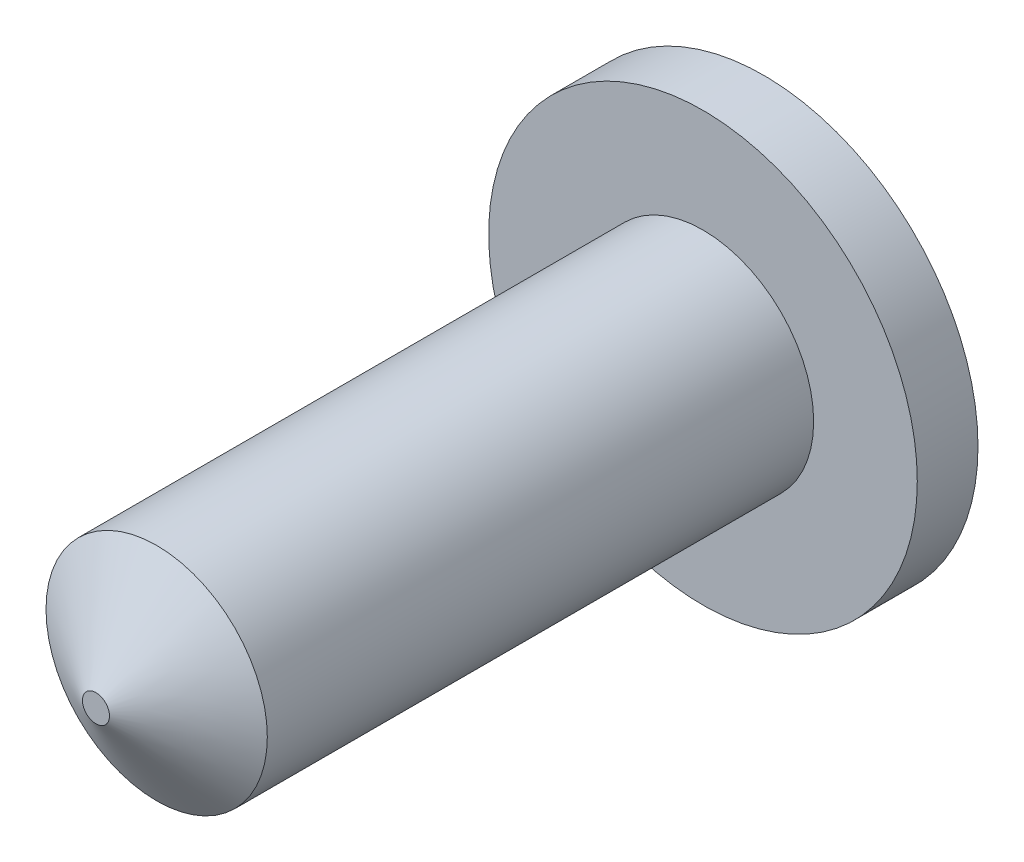
ISO-10303-21;
HEADER;
FILE_DESCRIPTION(('STEP AP214'),'2;1');
FILE_NAME('part.step','',(''),(''),'','','');
FILE_SCHEMA(('AUTOMOTIVE_DESIGN { 1 0 10303 214 1 1 1 1 }'));
ENDSEC;
DATA;
#1=APPLICATION_CONTEXT('core data for automotive mechanical design processes');
#2=APPLICATION_PROTOCOL_DEFINITION('international standard','automotive_design',2000,#1);
#3=PRODUCT_CONTEXT('',#1,'mechanical');
#4=PRODUCT('Part','Part','',(#3));
#5=PRODUCT_RELATED_PRODUCT_CATEGORY('part','',(#4));
#6=PRODUCT_DEFINITION_FORMATION('','',#4);
#7=PRODUCT_DEFINITION_CONTEXT('part definition',#1,'design');
#8=PRODUCT_DEFINITION('design','',#6,#7);
#9=PRODUCT_DEFINITION_SHAPE('','',#8);
#10=(LENGTH_UNIT() NAMED_UNIT(*) SI_UNIT(.MILLI.,.METRE.));
#11=(NAMED_UNIT(*) PLANE_ANGLE_UNIT() SI_UNIT($,.RADIAN.));
#12=(NAMED_UNIT(*) SI_UNIT($,.STERADIAN.) SOLID_ANGLE_UNIT());
#13=UNCERTAINTY_MEASURE_WITH_UNIT(LENGTH_MEASURE(1.E-05),#10,'distance_accuracy_value','');
#14=(GEOMETRIC_REPRESENTATION_CONTEXT(3) GLOBAL_UNCERTAINTY_ASSIGNED_CONTEXT((#13)) GLOBAL_UNIT_ASSIGNED_CONTEXT((#10,
#11,#12)) REPRESENTATION_CONTEXT('',''));
#15=CARTESIAN_POINT('',(0.,0.,0.));
#16=DIRECTION('',(0.,0.,1.));
#17=DIRECTION('',(1.,0.,0.));
#18=AXIS2_PLACEMENT_3D('',#15,#16,#17);
#19=CARTESIAN_POINT('',(0.,0.,10.));
#20=DIRECTION('',(0.,0.,-1.));
#21=DIRECTION('',(-1.,0.,0.));
#22=AXIS2_PLACEMENT_3D('',#19,#20,#21);
#23=CYLINDRICAL_SURFACE('',#22,35.3041974157938);
#24=CARTESIAN_POINT('',(0.,0.,10.));
#25=DIRECTION('',(0.,0.,1.));
#26=DIRECTION('',(1.,0.,0.));
#27=AXIS2_PLACEMENT_3D('',#24,#25,#26);
#28=CIRCLE('',#27,35.3041974157938);
#29=CARTESIAN_POINT('',(35.3041974157938,0.,10.));
#30=VERTEX_POINT('',#29);
#31=EDGE_CURVE('E46',#30,#30,#28,.T.);
#32=ORIENTED_EDGE('',*,*,#31,.F.);
#33=EDGE_LOOP('',(#32));
#34=FACE_BOUND('',#33,.T.);
#35=CARTESIAN_POINT('',(0.,0.,0.));
#36=DIRECTION('',(0.,0.,1.));
#37=DIRECTION('',(1.,0.,0.));
#38=AXIS2_PLACEMENT_3D('',#35,#36,#37);
#39=CIRCLE('',#38,35.3041974157938);
#40=CARTESIAN_POINT('',(35.3041974157938,0.,0.));
#41=VERTEX_POINT('',#40);
#42=EDGE_CURVE('E49',#41,#41,#39,.T.);
#43=ORIENTED_EDGE('',*,*,#42,.T.);
#44=EDGE_LOOP('',(#43));
#45=FACE_BOUND('',#44,.T.);
#46=ADVANCED_FACE('F31',(#34,#45),#23,.T.);
#47=CARTESIAN_POINT('',(0.,0.,10.));
#48=DIRECTION('',(0.,0.,1.));
#49=DIRECTION('',(1.,0.,0.));
#50=AXIS2_PLACEMENT_3D('',#47,#48,#49);
#51=PLANE('',#50);
#52=CARTESIAN_POINT('',(0.,0.,10.));
#53=DIRECTION('',(0.,0.,1.));
#54=DIRECTION('',(1.,0.,0.));
#55=AXIS2_PLACEMENT_3D('',#52,#53,#54);
#56=CIRCLE('',#55,18.2292595082549);
#57=CARTESIAN_POINT('',(-18.2292595082549,0.,9.99999999999999));
#58=VERTEX_POINT('',#57);
#59=EDGE_CURVE('E42',#58,#58,#56,.T.);
#60=ORIENTED_EDGE('',*,*,#59,.F.);
#61=EDGE_LOOP('',(#60));
#62=FACE_BOUND('',#61,.T.);
#63=ORIENTED_EDGE('',*,*,#31,.T.);
#64=EDGE_LOOP('',(#63));
#65=FACE_BOUND('',#64,.T.);
#66=ADVANCED_FACE('F55',(#62,#65),#51,.T.);
#67=CARTESIAN_POINT('',(0.,0.,0.));
#68=DIRECTION('',(0.,0.,1.));
#69=DIRECTION('',(1.,0.,0.));
#70=AXIS2_PLACEMENT_3D('',#67,#68,#69);
#71=PLANE('',#70);
#72=ORIENTED_EDGE('',*,*,#42,.F.);
#73=EDGE_LOOP('',(#72));
#74=FACE_BOUND('',#73,.T.);
#75=ADVANCED_FACE('F61',(#74),#71,.F.);
#76=CARTESIAN_POINT('',(0.,0.,110.));
#77=DIRECTION('',(0.,0.,-1.));
#78=DIRECTION('',(-1.,0.,0.));
#79=AXIS2_PLACEMENT_3D('',#76,#77,#78);
#80=CYLINDRICAL_SURFACE('',#79,18.2292595082549);
#81=CARTESIAN_POINT('',(0.,0.,100.));
#82=DIRECTION('',(0.,0.,1.));
#83=DIRECTION('',(1.,0.,0.));
#84=AXIS2_PLACEMENT_3D('',#81,#82,#83);
#85=CIRCLE('',#84,18.2292595082549);
#86=CARTESIAN_POINT('',(-18.2292595082549,0.,100.));
#87=VERTEX_POINT('',#86);
#88=EDGE_CURVE('E10',#87,#87,#85,.F.);
#89=CARTESIAN_POINT('',(-18.2292595082549,0.,100.));
#90=CARTESIAN_POINT('',(-18.2292595082549,0.,99.0625));
#91=CARTESIAN_POINT('',(-18.2292595082549,0.,98.125));
#92=CARTESIAN_POINT('',(-18.2292595082549,0.,96.25));
#93=CARTESIAN_POINT('',(-18.2292595082549,0.,95.3125));
#94=CARTESIAN_POINT('',(-18.2292595082549,0.,93.4375));
#95=CARTESIAN_POINT('',(-18.2292595082549,0.,92.5));
#96=CARTESIAN_POINT('',(-18.2292595082549,0.,90.625));
#97=CARTESIAN_POINT('',(-18.2292595082549,0.,89.6875));
#98=CARTESIAN_POINT('',(-18.2292595082549,0.,87.8125));
#99=CARTESIAN_POINT('',(-18.2292595082549,0.,86.875));
#100=CARTESIAN_POINT('',(-18.2292595082549,0.,85.));
#101=CARTESIAN_POINT('',(-18.2292595082549,0.,84.0625));
#102=CARTESIAN_POINT('',(-18.2292595082549,0.,82.1875));
#103=CARTESIAN_POINT('',(-18.2292595082549,0.,81.25));
#104=CARTESIAN_POINT('',(-18.2292595082549,0.,79.375));
#105=CARTESIAN_POINT('',(-18.2292595082549,0.,78.4375));
#106=CARTESIAN_POINT('',(-18.2292595082549,0.,76.5625));
#107=CARTESIAN_POINT('',(-18.2292595082549,0.,75.625));
#108=CARTESIAN_POINT('',(-18.2292595082549,0.,73.75));
#109=CARTESIAN_POINT('',(-18.2292595082549,0.,72.8125));
#110=CARTESIAN_POINT('',(-18.2292595082549,0.,70.9375));
#111=CARTESIAN_POINT('',(-18.2292595082549,0.,70.));
#112=CARTESIAN_POINT('',(-18.2292595082549,0.,68.125));
#113=CARTESIAN_POINT('',(-18.2292595082549,0.,67.1875));
#114=CARTESIAN_POINT('',(-18.2292595082549,0.,65.3125));
#115=CARTESIAN_POINT('',(-18.2292595082549,0.,64.375));
#116=CARTESIAN_POINT('',(-18.2292595082549,0.,62.5));
#117=CARTESIAN_POINT('',(-18.2292595082549,0.,61.5625));
#118=CARTESIAN_POINT('',(-18.2292595082549,0.,59.6875));
#119=CARTESIAN_POINT('',(-18.2292595082549,0.,58.75));
#120=CARTESIAN_POINT('',(-18.2292595082549,0.,56.875));
#121=CARTESIAN_POINT('',(-18.2292595082549,0.,55.9375));
#122=CARTESIAN_POINT('',(-18.2292595082549,0.,54.0625));
#123=CARTESIAN_POINT('',(-18.2292595082549,0.,53.125));
#124=CARTESIAN_POINT('',(-18.2292595082549,0.,51.25));
#125=CARTESIAN_POINT('',(-18.2292595082549,0.,50.3125));
#126=CARTESIAN_POINT('',(-18.2292595082549,0.,48.4375));
#127=CARTESIAN_POINT('',(-18.2292595082549,0.,47.5));
#128=CARTESIAN_POINT('',(-18.2292595082549,0.,45.625));
#129=CARTESIAN_POINT('',(-18.2292595082549,0.,44.6875));
#130=CARTESIAN_POINT('',(-18.2292595082549,0.,42.8125));
#131=CARTESIAN_POINT('',(-18.2292595082549,0.,41.875));
#132=CARTESIAN_POINT('',(-18.2292595082549,0.,40.));
#133=CARTESIAN_POINT('',(-18.2292595082549,0.,39.0625));
#134=CARTESIAN_POINT('',(-18.2292595082549,0.,37.1875));
#135=CARTESIAN_POINT('',(-18.2292595082549,0.,36.25));
#136=CARTESIAN_POINT('',(-18.2292595082549,0.,34.375));
#137=CARTESIAN_POINT('',(-18.2292595082549,0.,33.4375));
#138=CARTESIAN_POINT('',(-18.2292595082549,0.,31.5625));
#139=CARTESIAN_POINT('',(-18.2292595082549,0.,30.625));
#140=CARTESIAN_POINT('',(-18.2292595082549,0.,28.75));
#141=CARTESIAN_POINT('',(-18.2292595082549,0.,27.8125));
#142=CARTESIAN_POINT('',(-18.2292595082549,0.,25.9375));
#143=CARTESIAN_POINT('',(-18.2292595082549,0.,25.));
#144=CARTESIAN_POINT('',(-18.2292595082549,0.,23.125));
#145=CARTESIAN_POINT('',(-18.2292595082549,0.,22.1875));
#146=CARTESIAN_POINT('',(-18.2292595082549,0.,20.3125));
#147=CARTESIAN_POINT('',(-18.2292595082549,0.,19.375));
#148=CARTESIAN_POINT('',(-18.2292595082549,0.,17.5));
#149=CARTESIAN_POINT('',(-18.2292595082549,0.,16.5625));
#150=CARTESIAN_POINT('',(-18.2292595082549,0.,14.6875));
#151=CARTESIAN_POINT('',(-18.2292595082549,0.,13.75));
#152=CARTESIAN_POINT('',(-18.2292595082549,0.,11.875));
#153=CARTESIAN_POINT('',(-18.2292595082549,0.,10.9375));
#154=CARTESIAN_POINT('',(-18.2292595082549,0.,9.99999999999999));
#155=B_SPLINE_CURVE_WITH_KNOTS('',3,(#89,#90,#91,#92,#93,#94,#95,#96,#97,#98,#99,#100,#101,#102,
#103,#104,#105,#106,#107,#108,#109,#110,#111,#112,#113,#114,#115,#116,#117,#118,#119,#120,#121,
#122,#123,#124,#125,#126,#127,#128,#129,#130,#131,#132,#133,#134,#135,#136,#137,#138,#139,#140,
#141,#142,#143,#144,#145,#146,#147,#148,#149,#150,#151,#152,#153,#154),.UNSPECIFIED.,.F.,.F.,(4,
2,2,2,2,2,2,2,2,2,2,2,2,2,2,2,2,2,2,2,2,2,2,2,2,2,2,2,2,2,2,2,4),(0.,2.81250000000001,
5.62500000000001,8.4375,11.25,14.0625,16.875,19.6875,22.5,25.3125,28.125,30.9375,33.75,36.5625,
39.375,42.1875,45.,47.8125,50.625,53.4375,56.25,59.0625,61.875,64.6875,67.5,70.3125,73.125,
75.9375,78.75,81.5625,84.375,87.1875,90.),.UNSPECIFIED.);
#156=EDGE_CURVE('BSEAM63',#87,#58,#155,.T.);
#157=ORIENTED_EDGE('',*,*,#88,.T.);
#158=ORIENTED_EDGE('',*,*,#59,.T.);
#159=ORIENTED_EDGE('',*,*,#156,.T.);
#160=ORIENTED_EDGE('',*,*,#156,.F.);
#161=EDGE_LOOP('',(#157,#159,#158,#160));
#162=FACE_BOUND('',#161,.T.);
#163=ADVANCED_FACE('F63',(#162),#80,.T.);
#164=CARTESIAN_POINT('',(0.,0.,110.));
#165=DIRECTION('',(0.,0.,1.));
#166=DIRECTION('',(1.,0.,0.));
#167=AXIS2_PLACEMENT_3D('',#164,#165,#166);
#168=PLANE('',#167);
#169=CARTESIAN_POINT('',(0.,0.,110.));
#170=DIRECTION('',(0.,0.,1.));
#171=DIRECTION('',(1.,0.,0.));
#172=AXIS2_PLACEMENT_3D('',#169,#170,#171);
#173=CIRCLE('',#172,2.22591421784446);
#174=CARTESIAN_POINT('',(-2.22591421784447,0.,110.));
#175=VERTEX_POINT('',#174);
#176=EDGE_CURVE('E38',#175,#175,#173,.T.);
#177=ORIENTED_EDGE('',*,*,#176,.T.);
#178=EDGE_LOOP('',(#177));
#179=FACE_BOUND('',#178,.T.);
#180=ADVANCED_FACE('F69',(#179),#168,.T.);
#181=CARTESIAN_POINT('',(0.,0.,110.));
#182=DIRECTION('',(0.,0.,-1.));
#183=DIRECTION('',(-1.,0.,0.));
#184=AXIS2_PLACEMENT_3D('',#181,#182,#183);
#185=CONICAL_SURFACE('',#184,2.22591421784446,1.01229096615671);
#186=CARTESIAN_POINT('',(-18.2292595082549,0.,99.9999999999999));
#187=CARTESIAN_POINT('',(-18.0625579948131,0.,100.104166666667));
#188=CARTESIAN_POINT('',(-17.8958564813714,0.,100.208333333333));
#189=CARTESIAN_POINT('',(-17.5624534544878,0.,100.416666666667));
#190=CARTESIAN_POINT('',(-17.395751941046,0.,100.520833333333));
#191=CARTESIAN_POINT('',(-17.0623489141625,0.,100.729166666667));
#192=CARTESIAN_POINT('',(-16.8956474007207,0.,100.833333333333));
#193=CARTESIAN_POINT('',(-16.5622443738371,0.,101.041666666667));
#194=CARTESIAN_POINT('',(-16.3955428603954,0.,101.145833333333));
#195=CARTESIAN_POINT('',(-16.0621398335118,0.,101.354166666667));
#196=CARTESIAN_POINT('',(-15.89543832007,0.,101.458333333333));
#197=CARTESIAN_POINT('',(-15.5620352931865,0.,101.666666666667));
#198=CARTESIAN_POINT('',(-15.3953337797447,0.,101.770833333333));
#199=CARTESIAN_POINT('',(-15.0619307528612,0.,101.979166666667));
#200=CARTESIAN_POINT('',(-14.8952292394194,0.,102.083333333333));
#201=CARTESIAN_POINT('',(-14.5618262125358,0.,102.291666666667));
#202=CARTESIAN_POINT('',(-14.3951246990941,0.,102.395833333333));
#203=CARTESIAN_POINT('',(-14.0617216722105,0.,102.604166666667));
#204=CARTESIAN_POINT('',(-13.8950201587687,0.,102.708333333333));
#205=CARTESIAN_POINT('',(-13.5616171318852,0.,102.916666666667));
#206=CARTESIAN_POINT('',(-13.3949156184434,0.,103.020833333333));
#207=CARTESIAN_POINT('',(-13.0615125915599,0.,103.229166666667));
#208=CARTESIAN_POINT('',(-12.8948110781181,0.,103.333333333333));
#209=CARTESIAN_POINT('',(-12.5614080512345,0.,103.541666666667));
#210=CARTESIAN_POINT('',(-12.3947065377928,0.,103.645833333333));
#211=CARTESIAN_POINT('',(-12.0613035109092,0.,103.854166666667));
#212=CARTESIAN_POINT('',(-11.8946019974674,0.,103.958333333333));
#213=CARTESIAN_POINT('',(-11.5611989705839,0.,104.166666666667));
#214=CARTESIAN_POINT('',(-11.3944974571421,0.,104.270833333333));
#215=CARTESIAN_POINT('',(-11.0610944302586,0.,104.479166666667));
#216=CARTESIAN_POINT('',(-10.8943929168168,0.,104.583333333333));
#217=CARTESIAN_POINT('',(-10.5609898899332,0.,104.791666666667));
#218=CARTESIAN_POINT('',(-10.3942883764915,0.,104.895833333333));
#219=CARTESIAN_POINT('',(-10.0608853496079,0.,105.104166666667));
#220=CARTESIAN_POINT('',(-9.89418383616614,0.,105.208333333333));
#221=CARTESIAN_POINT('',(-9.56078080928259,0.,105.416666666667));
#222=CARTESIAN_POINT('',(-9.39407929584081,0.,105.520833333333));
#223=CARTESIAN_POINT('',(-9.06067626895726,0.,105.729166666667));
#224=CARTESIAN_POINT('',(-8.89397475551548,0.,105.833333333333));
#225=CARTESIAN_POINT('',(-8.56057172863193,0.,106.041666666667));
#226=CARTESIAN_POINT('',(-8.39387021519016,0.,106.145833333333));
#227=CARTESIAN_POINT('',(-8.06046718830661,0.,106.354166666667));
#228=CARTESIAN_POINT('',(-7.89376567486483,0.,106.458333333333));
#229=CARTESIAN_POINT('',(-7.56036264798128,0.,106.666666666667));
#230=CARTESIAN_POINT('',(-7.3936611345395,0.,106.770833333333));
#231=CARTESIAN_POINT('',(-7.06025810765595,0.,106.979166666667));
#232=CARTESIAN_POINT('',(-6.89355659421418,0.,107.083333333333));
#233=CARTESIAN_POINT('',(-6.56015356733063,0.,107.291666666667));
#234=CARTESIAN_POINT('',(-6.39345205388885,0.,107.395833333333));
#235=CARTESIAN_POINT('',(-6.0600490270053,0.,107.604166666667));
#236=CARTESIAN_POINT('',(-5.89334751356353,0.,107.708333333333));
#237=CARTESIAN_POINT('',(-5.55994448667998,0.,107.916666666667));
#238=CARTESIAN_POINT('',(-5.3932429732382,0.,108.020833333333));
#239=CARTESIAN_POINT('',(-5.05983994635465,0.,108.229166666667));
#240=CARTESIAN_POINT('',(-4.89313843291287,0.,108.333333333333));
#241=CARTESIAN_POINT('',(-4.55973540602932,0.,108.541666666667));
#242=CARTESIAN_POINT('',(-4.39303389258755,0.,108.645833333333));
#243=CARTESIAN_POINT('',(-4.059630865704,0.,108.854166666667));
#244=CARTESIAN_POINT('',(-3.89292935226222,0.,108.958333333333));
#245=CARTESIAN_POINT('',(-3.55952632537867,0.,109.166666666667));
#246=CARTESIAN_POINT('',(-3.39282481193689,0.,109.270833333333));
#247=CARTESIAN_POINT('',(-3.05942178505334,0.,109.479166666667));
#248=CARTESIAN_POINT('',(-2.89272027161157,0.,109.583333333333));
#249=CARTESIAN_POINT('',(-2.55931724472802,0.,109.791666666667));
#250=CARTESIAN_POINT('',(-2.39261573128625,0.,109.895833333333));
#251=CARTESIAN_POINT('',(-2.22591421784447,0.,110.));
#252=B_SPLINE_CURVE_WITH_KNOTS('',3,(#186,#187,#188,#189,#190,#191,#192,#193,#194,#195,#196,
#197,#198,#199,#200,#201,#202,#203,#204,#205,#206,#207,#208,#209,#210,#211,#212,#213,#214,#215,
#216,#217,#218,#219,#220,#221,#222,#223,#224,#225,#226,#227,#228,#229,#230,#231,#232,#233,#234,
#235,#236,#237,#238,#239,#240,#241,#242,#243,#244,#245,#246,#247,#248,#249,#250,#251),
.UNSPECIFIED.,.F.,.F.,(4,2,2,2,2,2,2,2,2,2,2,2,2,2,2,2,2,2,2,2,2,2,2,2,2,2,2,2,2,2,2,2,4),(0.,
0.589712473374956,1.17942494674991,1.76913742012487,2.35884989349982,2.94856236687477,
3.53827484024973,4.12798731362468,4.71769978699964,5.30741226037459,5.89712473374955,
6.4868372071245,7.07654968049946,7.66626215387441,8.25597462724936,8.84568710062431,
9.43539957399927,10.0251120473742,10.6148245207492,11.2045369941241,11.7942494674991,
12.383961940874,12.973674414249,13.563386887624,14.1530993609989,14.7428118343739,
15.3325243077488,15.9222367811238,16.5119492544987,17.1016617278737,17.6913742012486,
18.2810866746236,18.8707991479985),.UNSPECIFIED.);
#253=EDGE_CURVE('BSEAM33',#87,#175,#252,.T.);
#254=ORIENTED_EDGE('',*,*,#88,.F.);
#255=ORIENTED_EDGE('',*,*,#176,.F.);
#256=ORIENTED_EDGE('',*,*,#253,.T.);
#257=ORIENTED_EDGE('',*,*,#253,.F.);
#258=EDGE_LOOP('',(#254,#256,#255,#257));
#259=FACE_BOUND('',#258,.T.);
#260=ADVANCED_FACE('F33',(#259),#185,.T.);
#261=CLOSED_SHELL('',(#46,#66,#75,#163,#180,#260));
#262=MANIFOLD_SOLID_BREP('B2',#261);
#263=ADVANCED_BREP_SHAPE_REPRESENTATION('',(#18,#262),#14);
#264=SHAPE_DEFINITION_REPRESENTATION(#9,#263);
ENDSEC;
END-ISO-10303-21;
